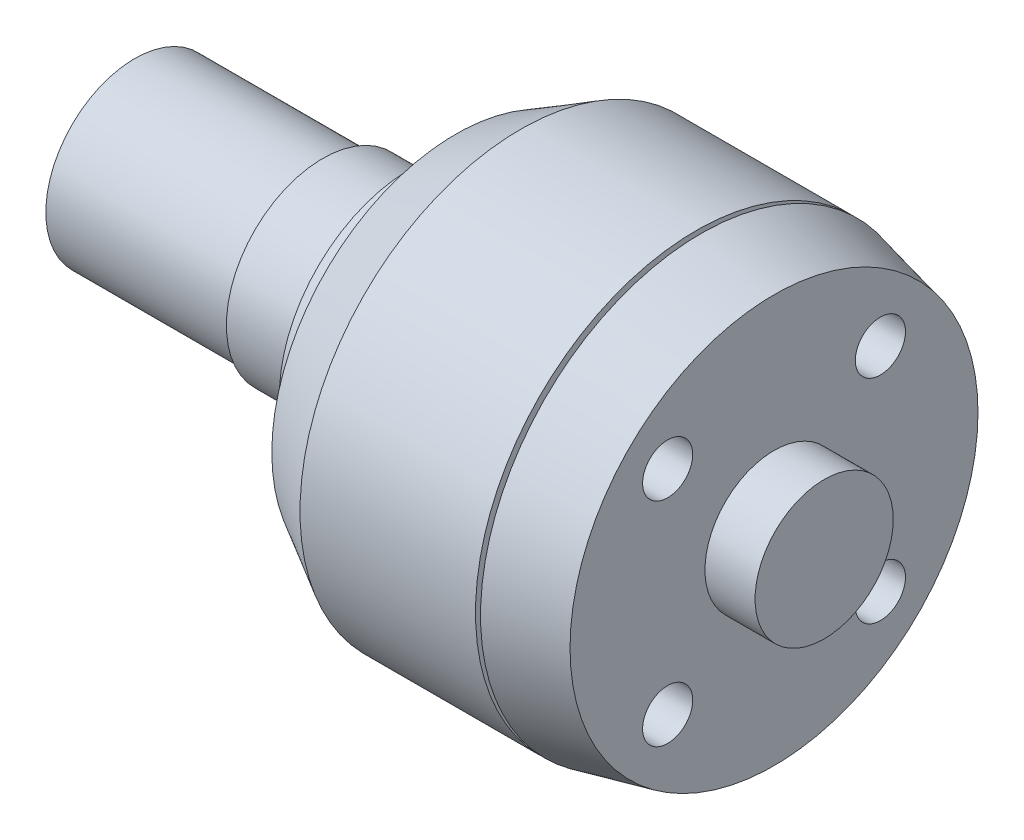
ISO-10303-21;
HEADER;
FILE_DESCRIPTION(('STEP AP214'),'2;1');
FILE_NAME('part.step','',(''),(''),'','','');
FILE_SCHEMA(('AUTOMOTIVE_DESIGN { 1 0 10303 214 1 1 1 1 }'));
ENDSEC;
DATA;
#1=APPLICATION_CONTEXT('core data for automotive mechanical design processes');
#2=APPLICATION_PROTOCOL_DEFINITION('international standard','automotive_design',2000,#1);
#3=PRODUCT_CONTEXT('',#1,'mechanical');
#4=PRODUCT('Part','Part','',(#3));
#5=PRODUCT_RELATED_PRODUCT_CATEGORY('part','',(#4));
#6=PRODUCT_DEFINITION_FORMATION('','',#4);
#7=PRODUCT_DEFINITION_CONTEXT('part definition',#1,'design');
#8=PRODUCT_DEFINITION('design','',#6,#7);
#9=PRODUCT_DEFINITION_SHAPE('','',#8);
#10=(LENGTH_UNIT() NAMED_UNIT(*) SI_UNIT(.MILLI.,.METRE.));
#11=(NAMED_UNIT(*) PLANE_ANGLE_UNIT() SI_UNIT($,.RADIAN.));
#12=(NAMED_UNIT(*) SI_UNIT($,.STERADIAN.) SOLID_ANGLE_UNIT());
#13=UNCERTAINTY_MEASURE_WITH_UNIT(LENGTH_MEASURE(1.E-05),#10,'distance_accuracy_value','');
#14=(GEOMETRIC_REPRESENTATION_CONTEXT(3) GLOBAL_UNCERTAINTY_ASSIGNED_CONTEXT((#13)) GLOBAL_UNIT_ASSIGNED_CONTEXT((#10,
#11,#12)) REPRESENTATION_CONTEXT('',''));
#15=CARTESIAN_POINT('',(0.,0.,0.));
#16=DIRECTION('',(0.,0.,1.));
#17=DIRECTION('',(1.,0.,0.));
#18=AXIS2_PLACEMENT_3D('',#15,#16,#17);
#19=CARTESIAN_POINT('',(16.2040634309573,0.,0.));
#20=DIRECTION('',(1.,0.,0.));
#21=DIRECTION('',(0.,0.,-1.));
#22=AXIS2_PLACEMENT_3D('',#19,#20,#21);
#23=CYLINDRICAL_SURFACE('',#22,3.54481033344011);
#24=CARTESIAN_POINT('',(-11.2959365690427,0.,0.));
#25=DIRECTION('',(1.,0.,0.));
#26=DIRECTION('',(0.,0.,-1.));
#27=AXIS2_PLACEMENT_3D('',#24,#25,#26);
#28=CIRCLE('',#27,3.54481033344011);
#29=CARTESIAN_POINT('',(-11.2959365690427,0.,-3.54481033344011));
#30=VERTEX_POINT('',#29);
#31=EDGE_CURVE('E12',#30,#30,#28,.T.);
#32=ORIENTED_EDGE('',*,*,#31,.T.);
#33=EDGE_LOOP('',(#32));
#34=FACE_BOUND('',#33,.T.);
#35=CARTESIAN_POINT('',(-3.79593656904273,0.,0.));
#36=DIRECTION('',(1.,0.,0.));
#37=DIRECTION('',(0.,0.,-1.));
#38=AXIS2_PLACEMENT_3D('',#35,#36,#37);
#39=CIRCLE('',#38,3.54481033344011);
#40=CARTESIAN_POINT('',(-3.79593656904273,0.,-3.54481033344011));
#41=VERTEX_POINT('',#40);
#42=EDGE_CURVE('E93',#41,#41,#39,.T.);
#43=ORIENTED_EDGE('',*,*,#42,.F.);
#44=EDGE_LOOP('',(#43));
#45=FACE_BOUND('',#44,.T.);
#46=ADVANCED_FACE('F44',(#34,#45),#23,.T.);
#47=CARTESIAN_POINT('',(-11.2959365690427,0.,0.));
#48=DIRECTION('',(-1.,0.,0.));
#49=DIRECTION('',(0.,0.,1.));
#50=AXIS2_PLACEMENT_3D('',#47,#48,#49);
#51=PLANE('',#50);
#52=ORIENTED_EDGE('',*,*,#31,.F.);
#53=EDGE_LOOP('',(#52));
#54=FACE_BOUND('',#53,.T.);
#55=ADVANCED_FACE('F150',(#54),#51,.T.);
#56=CARTESIAN_POINT('',(16.2040634309573,0.,-2.75506674369654));
#57=DIRECTION('',(1.,0.,0.));
#58=DIRECTION('',(0.,0.,-1.));
#59=AXIS2_PLACEMENT_3D('',#56,#57,#58);
#60=PLANE('',#59);
#61=CARTESIAN_POINT('',(16.2040634309573,0.,0.));
#62=DIRECTION('',(1.,0.,0.));
#63=DIRECTION('',(0.,0.,-1.));
#64=AXIS2_PLACEMENT_3D('',#61,#62,#63);
#65=CIRCLE('',#64,2.75506674369654);
#66=CARTESIAN_POINT('',(16.2040634309573,0.,-2.75506674369654));
#67=VERTEX_POINT('',#66);
#68=EDGE_CURVE('E50',#67,#67,#65,.T.);
#69=ORIENTED_EDGE('',*,*,#68,.T.);
#70=EDGE_LOOP('',(#69));
#71=FACE_BOUND('',#70,.T.);
#72=ADVANCED_FACE('F145',(#71),#60,.T.);
#73=CARTESIAN_POINT('',(16.2040634309573,0.,0.));
#74=DIRECTION('',(1.,0.,0.));
#75=DIRECTION('',(0.,0.,-1.));
#76=AXIS2_PLACEMENT_3D('',#73,#74,#75);
#77=CYLINDRICAL_SURFACE('',#76,2.75506674369654);
#78=CARTESIAN_POINT('',(14.2040634309573,0.,0.));
#79=DIRECTION('',(1.,0.,0.));
#80=DIRECTION('',(0.,0.,-1.));
#81=AXIS2_PLACEMENT_3D('',#78,#79,#80);
#82=CIRCLE('',#81,2.75506674369654);
#83=CARTESIAN_POINT('',(14.2040634309573,0.,-2.75506674369654));
#84=VERTEX_POINT('',#83);
#85=EDGE_CURVE('E54',#84,#84,#82,.T.);
#86=ORIENTED_EDGE('',*,*,#85,.T.);
#87=EDGE_LOOP('',(#86));
#88=FACE_BOUND('',#87,.T.);
#89=ORIENTED_EDGE('',*,*,#68,.F.);
#90=EDGE_LOOP('',(#89));
#91=FACE_BOUND('',#90,.T.);
#92=ADVANCED_FACE('F134',(#88,#91),#77,.T.);
#93=CARTESIAN_POINT('',(14.2040634309573,0.,-8.13630860878238));
#94=DIRECTION('',(1.,0.,0.));
#95=DIRECTION('',(0.,0.,-1.));
#96=AXIS2_PLACEMENT_3D('',#93,#94,#95);
#97=PLANE('',#96);
#98=CARTESIAN_POINT('',(14.2040634309573,4.24264068711929,-4.24264068711929));
#99=DIRECTION('',(1.,0.,0.));
#100=DIRECTION('',(0.,0.,-1.));
#101=AXIS2_PLACEMENT_3D('',#98,#99,#100);
#102=CIRCLE('',#101,1.);
#103=CARTESIAN_POINT('',(14.2040634309573,4.24264068711929,-5.24264068711929));
#104=VERTEX_POINT('',#103);
#105=EDGE_CURVE('E110',#104,#104,#102,.T.);
#106=ORIENTED_EDGE('',*,*,#105,.F.);
#107=EDGE_LOOP('',(#106));
#108=FACE_BOUND('',#107,.T.);
#109=CARTESIAN_POINT('',(14.2040634309573,-4.24264068711929,4.24264068711928));
#110=DIRECTION('',(1.,0.,0.));
#111=DIRECTION('',(0.,0.,-1.));
#112=AXIS2_PLACEMENT_3D('',#109,#110,#111);
#113=CIRCLE('',#112,1.);
#114=CARTESIAN_POINT('',(14.2040634309573,-4.24264068711929,3.24264068711928));
#115=VERTEX_POINT('',#114);
#116=EDGE_CURVE('E103',#115,#115,#113,.T.);
#117=ORIENTED_EDGE('',*,*,#116,.F.);
#118=EDGE_LOOP('',(#117));
#119=FACE_BOUND('',#118,.T.);
#120=CARTESIAN_POINT('',(14.2040634309573,4.24264068711929,4.24264068711928));
#121=DIRECTION('',(1.,0.,0.));
#122=DIRECTION('',(0.,0.,-1.));
#123=AXIS2_PLACEMENT_3D('',#120,#121,#122);
#124=CIRCLE('',#123,1.);
#125=CARTESIAN_POINT('',(14.2040634309573,4.24264068711929,3.24264068711928));
#126=VERTEX_POINT('',#125);
#127=EDGE_CURVE('E115',#126,#126,#124,.T.);
#128=ORIENTED_EDGE('',*,*,#127,.F.);
#129=EDGE_LOOP('',(#128));
#130=FACE_BOUND('',#129,.T.);
#131=CARTESIAN_POINT('',(14.2040634309573,-4.24264068711929,-4.24264068711929));
#132=DIRECTION('',(1.,0.,0.));
#133=DIRECTION('',(0.,0.,-1.));
#134=AXIS2_PLACEMENT_3D('',#131,#132,#133);
#135=CIRCLE('',#134,1.);
#136=CARTESIAN_POINT('',(14.2040634309573,-4.24264068711929,-5.24264068711929));
#137=VERTEX_POINT('',#136);
#138=EDGE_CURVE('E97',#137,#137,#135,.T.);
#139=ORIENTED_EDGE('',*,*,#138,.F.);
#140=EDGE_LOOP('',(#139));
#141=FACE_BOUND('',#140,.T.);
#142=CARTESIAN_POINT('',(14.2040634309573,0.,0.));
#143=DIRECTION('',(1.,0.,0.));
#144=DIRECTION('',(0.,0.,-1.));
#145=AXIS2_PLACEMENT_3D('',#142,#143,#144);
#146=CIRCLE('',#145,8.13630860878238);
#147=CARTESIAN_POINT('',(14.2040634309573,0.,-8.13630860878238));
#148=VERTEX_POINT('',#147);
#149=EDGE_CURVE('E58',#148,#148,#146,.T.);
#150=ORIENTED_EDGE('',*,*,#149,.T.);
#151=EDGE_LOOP('',(#150));
#152=FACE_BOUND('',#151,.T.);
#153=ORIENTED_EDGE('',*,*,#85,.F.);
#154=EDGE_LOOP('',(#153));
#155=FACE_BOUND('',#154,.T.);
#156=ADVANCED_FACE('F130',(#108,#119,#130,#141,#152,#155),#97,.T.);
#157=CARTESIAN_POINT('',(14.2040634309573,0.,0.));
#158=DIRECTION('',(-1.,0.,0.));
#159=DIRECTION('',(0.,0.,1.));
#160=AXIS2_PLACEMENT_3D('',#157,#158,#159);
#161=CONICAL_SURFACE('',#160,8.13630860878238,0.224529527170123);
#162=CARTESIAN_POINT('',(11.2979836358391,0.,0.));
#163=DIRECTION('',(1.,0.,0.));
#164=DIRECTION('',(0.,0.,-1.));
#165=AXIS2_PLACEMENT_3D('',#162,#163,#164);
#166=CIRCLE('',#165,8.8);
#167=CARTESIAN_POINT('',(11.2979836358391,0.,-8.8));
#168=VERTEX_POINT('',#167);
#169=EDGE_CURVE('E63',#168,#168,#166,.T.);
#170=ORIENTED_EDGE('',*,*,#169,.T.);
#171=EDGE_LOOP('',(#170));
#172=FACE_BOUND('',#171,.T.);
#173=ORIENTED_EDGE('',*,*,#149,.F.);
#174=EDGE_LOOP('',(#173));
#175=FACE_BOUND('',#174,.T.);
#176=ADVANCED_FACE('F133',(#172,#175),#161,.T.);
#177=CARTESIAN_POINT('',(11.2979836358391,0.,-7.08537533518294));
#178=DIRECTION('',(-1.,0.,0.));
#179=DIRECTION('',(0.,0.,1.));
#180=AXIS2_PLACEMENT_3D('',#177,#178,#179);
#181=PLANE('',#180);
#182=CARTESIAN_POINT('',(11.2979836358391,0.,0.));
#183=DIRECTION('',(1.,0.,0.));
#184=DIRECTION('',(0.,0.,-1.));
#185=AXIS2_PLACEMENT_3D('',#182,#183,#184);
#186=CIRCLE('',#185,7.08537533518294);
#187=CARTESIAN_POINT('',(11.2979836358391,0.,-7.08537533518294));
#188=VERTEX_POINT('',#187);
#189=EDGE_CURVE('E66',#188,#188,#186,.T.);
#190=ORIENTED_EDGE('',*,*,#189,.T.);
#191=EDGE_LOOP('',(#190));
#192=FACE_BOUND('',#191,.T.);
#193=ORIENTED_EDGE('',*,*,#169,.F.);
#194=EDGE_LOOP('',(#193));
#195=FACE_BOUND('',#194,.T.);
#196=ADVANCED_FACE('F212',(#192,#195),#181,.T.);
#197=CARTESIAN_POINT('',(16.2040634309573,0.,0.));
#198=DIRECTION('',(1.,0.,0.));
#199=DIRECTION('',(0.,0.,-1.));
#200=AXIS2_PLACEMENT_3D('',#197,#198,#199);
#201=CYLINDRICAL_SURFACE('',#200,7.08537533518294);
#202=CARTESIAN_POINT('',(11.0979836358391,0.,0.));
#203=DIRECTION('',(1.,0.,0.));
#204=DIRECTION('',(0.,0.,-1.));
#205=AXIS2_PLACEMENT_3D('',#202,#203,#204);
#206=CIRCLE('',#205,7.08537533518294);
#207=CARTESIAN_POINT('',(11.0979836358391,0.,-7.08537533518294));
#208=VERTEX_POINT('',#207);
#209=EDGE_CURVE('E69',#208,#208,#206,.T.);
#210=ORIENTED_EDGE('',*,*,#209,.T.);
#211=EDGE_LOOP('',(#210));
#212=FACE_BOUND('',#211,.T.);
#213=ORIENTED_EDGE('',*,*,#189,.F.);
#214=EDGE_LOOP('',(#213));
#215=FACE_BOUND('',#214,.T.);
#216=ADVANCED_FACE('F206',(#212,#215),#201,.T.);
#217=CARTESIAN_POINT('',(11.0979836358391,0.,-8.8));
#218=DIRECTION('',(1.,0.,0.));
#219=DIRECTION('',(0.,0.,-1.));
#220=AXIS2_PLACEMENT_3D('',#217,#218,#219);
#221=PLANE('',#220);
#222=CARTESIAN_POINT('',(11.0979836358391,0.,0.));
#223=DIRECTION('',(1.,0.,0.));
#224=DIRECTION('',(0.,0.,-1.));
#225=AXIS2_PLACEMENT_3D('',#222,#223,#224);
#226=CIRCLE('',#225,8.8);
#227=CARTESIAN_POINT('',(11.0979836358391,0.,-8.8));
#228=VERTEX_POINT('',#227);
#229=EDGE_CURVE('E72',#228,#228,#226,.T.);
#230=ORIENTED_EDGE('',*,*,#229,.T.);
#231=EDGE_LOOP('',(#230));
#232=FACE_BOUND('',#231,.T.);
#233=ORIENTED_EDGE('',*,*,#209,.F.);
#234=EDGE_LOOP('',(#233));
#235=FACE_BOUND('',#234,.T.);
#236=ADVANCED_FACE('F200',(#232,#235),#221,.T.);
#237=CARTESIAN_POINT('',(16.2040634309573,0.,0.));
#238=DIRECTION('',(1.,0.,0.));
#239=DIRECTION('',(0.,0.,-1.));
#240=AXIS2_PLACEMENT_3D('',#237,#238,#239);
#241=CYLINDRICAL_SURFACE('',#240,8.8);
#242=CARTESIAN_POINT('',(4.09798363583906,0.,0.));
#243=DIRECTION('',(1.,0.,0.));
#244=DIRECTION('',(0.,0.,-1.));
#245=AXIS2_PLACEMENT_3D('',#242,#243,#244);
#246=CIRCLE('',#245,8.8);
#247=CARTESIAN_POINT('',(4.09798363583906,0.,-8.8));
#248=VERTEX_POINT('',#247);
#249=EDGE_CURVE('E75',#248,#248,#246,.T.);
#250=ORIENTED_EDGE('',*,*,#249,.T.);
#251=EDGE_LOOP('',(#250));
#252=FACE_BOUND('',#251,.T.);
#253=ORIENTED_EDGE('',*,*,#229,.F.);
#254=EDGE_LOOP('',(#253));
#255=FACE_BOUND('',#254,.T.);
#256=ADVANCED_FACE('F194',(#252,#255),#241,.T.);
#257=CARTESIAN_POINT('',(4.09798363583906,0.,0.));
#258=DIRECTION('',(1.,0.,0.));
#259=DIRECTION('',(0.,0.,-1.));
#260=AXIS2_PLACEMENT_3D('',#257,#258,#259);
#261=CONICAL_SURFACE('',#260,8.8,0.515230487157352);
#262=CARTESIAN_POINT('',(1.50406343095727,0.,0.));
#263=DIRECTION('',(1.,0.,0.));
#264=DIRECTION('',(0.,0.,-1.));
#265=AXIS2_PLACEMENT_3D('',#262,#263,#264);
#266=CIRCLE('',#265,7.33120321042127);
#267=CARTESIAN_POINT('',(1.50406343095727,0.,-7.33120321042127));
#268=VERTEX_POINT('',#267);
#269=EDGE_CURVE('E78',#268,#268,#266,.T.);
#270=ORIENTED_EDGE('',*,*,#269,.T.);
#271=EDGE_LOOP('',(#270));
#272=FACE_BOUND('',#271,.T.);
#273=ORIENTED_EDGE('',*,*,#249,.F.);
#274=EDGE_LOOP('',(#273));
#275=FACE_BOUND('',#274,.T.);
#276=ADVANCED_FACE('F188',(#272,#275),#261,.T.);
#277=CARTESIAN_POINT('',(1.50406343095727,0.,-5.23139923501229));
#278=DIRECTION('',(-1.,0.,0.));
#279=DIRECTION('',(0.,0.,1.));
#280=AXIS2_PLACEMENT_3D('',#277,#278,#279);
#281=PLANE('',#280);
#282=CARTESIAN_POINT('',(1.50406343095727,0.,0.));
#283=DIRECTION('',(1.,0.,0.));
#284=DIRECTION('',(0.,0.,-1.));
#285=AXIS2_PLACEMENT_3D('',#282,#283,#284);
#286=CIRCLE('',#285,5.23139923501229);
#287=CARTESIAN_POINT('',(1.50406343095727,0.,-5.23139923501229));
#288=VERTEX_POINT('',#287);
#289=EDGE_CURVE('E81',#288,#288,#286,.T.);
#290=ORIENTED_EDGE('',*,*,#289,.T.);
#291=EDGE_LOOP('',(#290));
#292=FACE_BOUND('',#291,.T.);
#293=ORIENTED_EDGE('',*,*,#269,.F.);
#294=EDGE_LOOP('',(#293));
#295=FACE_BOUND('',#294,.T.);
#296=ADVANCED_FACE('F182',(#292,#295),#281,.T.);
#297=CARTESIAN_POINT('',(16.2040634309573,0.,0.));
#298=DIRECTION('',(1.,0.,0.));
#299=DIRECTION('',(0.,0.,-1.));
#300=AXIS2_PLACEMENT_3D('',#297,#298,#299);
#301=CYLINDRICAL_SURFACE('',#300,5.23139923501229);
#302=CARTESIAN_POINT('',(-0.295936569042726,0.,0.));
#303=DIRECTION('',(1.,0.,0.));
#304=DIRECTION('',(0.,0.,-1.));
#305=AXIS2_PLACEMENT_3D('',#302,#303,#304);
#306=CIRCLE('',#305,5.23139923501229);
#307=CARTESIAN_POINT('',(-0.295936569042727,0.,-5.23139923501229));
#308=VERTEX_POINT('',#307);
#309=EDGE_CURVE('E84',#308,#308,#306,.T.);
#310=ORIENTED_EDGE('',*,*,#309,.T.);
#311=EDGE_LOOP('',(#310));
#312=FACE_BOUND('',#311,.T.);
#313=ORIENTED_EDGE('',*,*,#289,.F.);
#314=EDGE_LOOP('',(#313));
#315=FACE_BOUND('',#314,.T.);
#316=ADVANCED_FACE('F176',(#312,#315),#301,.T.);
#317=CARTESIAN_POINT('',(-0.295936569042726,0.,-3.84395381815795));
#318=DIRECTION('',(-1.,0.,0.));
#319=DIRECTION('',(0.,0.,1.));
#320=AXIS2_PLACEMENT_3D('',#317,#318,#319);
#321=PLANE('',#320);
#322=CARTESIAN_POINT('',(-0.295936569042726,0.,0.));
#323=DIRECTION('',(1.,0.,0.));
#324=DIRECTION('',(0.,0.,-1.));
#325=AXIS2_PLACEMENT_3D('',#322,#323,#324);
#326=CIRCLE('',#325,3.84395381815795);
#327=CARTESIAN_POINT('',(-0.295936569042727,0.,-3.84395381815795));
#328=VERTEX_POINT('',#327);
#329=EDGE_CURVE('E87',#328,#328,#326,.T.);
#330=ORIENTED_EDGE('',*,*,#329,.T.);
#331=EDGE_LOOP('',(#330));
#332=FACE_BOUND('',#331,.T.);
#333=ORIENTED_EDGE('',*,*,#309,.F.);
#334=EDGE_LOOP('',(#333));
#335=FACE_BOUND('',#334,.T.);
#336=ADVANCED_FACE('F170',(#332,#335),#321,.T.);
#337=CARTESIAN_POINT('',(16.2040634309573,0.,0.));
#338=DIRECTION('',(1.,0.,0.));
#339=DIRECTION('',(0.,0.,-1.));
#340=AXIS2_PLACEMENT_3D('',#337,#338,#339);
#341=CYLINDRICAL_SURFACE('',#340,3.84395381815795);
#342=CARTESIAN_POINT('',(-3.79593656904273,0.,0.));
#343=DIRECTION('',(1.,0.,0.));
#344=DIRECTION('',(0.,0.,-1.));
#345=AXIS2_PLACEMENT_3D('',#342,#343,#344);
#346=CIRCLE('',#345,3.84395381815795);
#347=CARTESIAN_POINT('',(-3.79593656904273,0.,-3.84395381815795));
#348=VERTEX_POINT('',#347);
#349=EDGE_CURVE('E90',#348,#348,#346,.T.);
#350=ORIENTED_EDGE('',*,*,#349,.T.);
#351=EDGE_LOOP('',(#350));
#352=FACE_BOUND('',#351,.T.);
#353=ORIENTED_EDGE('',*,*,#329,.F.);
#354=EDGE_LOOP('',(#353));
#355=FACE_BOUND('',#354,.T.);
#356=ADVANCED_FACE('F164',(#352,#355),#341,.T.);
#357=CARTESIAN_POINT('',(-3.79593656904273,0.,-3.54481033344011));
#358=DIRECTION('',(-1.,0.,0.));
#359=DIRECTION('',(0.,0.,1.));
#360=AXIS2_PLACEMENT_3D('',#357,#358,#359);
#361=PLANE('',#360);
#362=ORIENTED_EDGE('',*,*,#42,.T.);
#363=EDGE_LOOP('',(#362));
#364=FACE_BOUND('',#363,.T.);
#365=ORIENTED_EDGE('',*,*,#349,.F.);
#366=EDGE_LOOP('',(#365));
#367=FACE_BOUND('',#366,.T.);
#368=ADVANCED_FACE('F160',(#364,#367),#361,.T.);
#369=CARTESIAN_POINT('',(12.2040634309573,-4.24264068711929,-4.24264068711929));
#370=DIRECTION('',(1.,0.,0.));
#371=DIRECTION('',(0.,0.,-1.));
#372=AXIS2_PLACEMENT_3D('',#369,#370,#371);
#373=CYLINDRICAL_SURFACE('',#372,1.);
#374=CARTESIAN_POINT('',(12.2040634309573,-4.24264068711929,-4.24264068711929));
#375=DIRECTION('',(1.,0.,0.));
#376=DIRECTION('',(0.,0.,-1.));
#377=AXIS2_PLACEMENT_3D('',#374,#375,#376);
#378=CIRCLE('',#377,1.);
#379=CARTESIAN_POINT('',(12.2040634309573,-4.24264068711929,-5.24264068711929));
#380=VERTEX_POINT('',#379);
#381=EDGE_CURVE('E96',#380,#380,#378,.T.);
#382=ORIENTED_EDGE('',*,*,#381,.F.);
#383=EDGE_LOOP('',(#382));
#384=FACE_BOUND('',#383,.T.);
#385=ORIENTED_EDGE('',*,*,#138,.T.);
#386=EDGE_LOOP('',(#385));
#387=FACE_BOUND('',#386,.T.);
#388=ADVANCED_FACE('F163',(#384,#387),#373,.F.);
#389=CARTESIAN_POINT('',(12.2040634309573,-4.24264068711929,-4.24264068711929));
#390=DIRECTION('',(1.,0.,0.));
#391=DIRECTION('',(0.,0.,-1.));
#392=AXIS2_PLACEMENT_3D('',#389,#390,#391);
#393=PLANE('',#392);
#394=ORIENTED_EDGE('',*,*,#381,.T.);
#395=EDGE_LOOP('',(#394));
#396=FACE_BOUND('',#395,.T.);
#397=ADVANCED_FACE('F126',(#396),#393,.T.);
#398=CARTESIAN_POINT('',(12.2040634309573,4.24264068711929,4.24264068711928));
#399=DIRECTION('',(1.,0.,0.));
#400=DIRECTION('',(0.,0.,-1.));
#401=AXIS2_PLACEMENT_3D('',#398,#399,#400);
#402=CYLINDRICAL_SURFACE('',#401,1.);
#403=CARTESIAN_POINT('',(12.2040634309573,4.24264068711929,4.24264068711928));
#404=DIRECTION('',(1.,0.,0.));
#405=DIRECTION('',(0.,0.,-1.));
#406=AXIS2_PLACEMENT_3D('',#403,#404,#405);
#407=CIRCLE('',#406,1.);
#408=CARTESIAN_POINT('',(12.2040634309573,4.24264068711929,3.24264068711928));
#409=VERTEX_POINT('',#408);
#410=EDGE_CURVE('E107',#409,#409,#407,.T.);
#411=ORIENTED_EDGE('',*,*,#410,.F.);
#412=EDGE_LOOP('',(#411));
#413=FACE_BOUND('',#412,.T.);
#414=ORIENTED_EDGE('',*,*,#127,.T.);
#415=EDGE_LOOP('',(#414));
#416=FACE_BOUND('',#415,.T.);
#417=ADVANCED_FACE('F123',(#413,#416),#402,.F.);
#418=CARTESIAN_POINT('',(12.2040634309573,4.24264068711929,4.24264068711928));
#419=DIRECTION('',(1.,0.,0.));
#420=DIRECTION('',(0.,0.,-1.));
#421=AXIS2_PLACEMENT_3D('',#418,#419,#420);
#422=PLANE('',#421);
#423=ORIENTED_EDGE('',*,*,#410,.T.);
#424=EDGE_LOOP('',(#423));
#425=FACE_BOUND('',#424,.T.);
#426=ADVANCED_FACE('F121',(#425),#422,.T.);
#427=CARTESIAN_POINT('',(12.2040634309573,-4.24264068711929,4.24264068711928));
#428=DIRECTION('',(1.,0.,0.));
#429=DIRECTION('',(0.,0.,-1.));
#430=AXIS2_PLACEMENT_3D('',#427,#428,#429);
#431=CYLINDRICAL_SURFACE('',#430,1.);
#432=CARTESIAN_POINT('',(12.2040634309573,-4.24264068711929,4.24264068711928));
#433=DIRECTION('',(1.,0.,0.));
#434=DIRECTION('',(0.,0.,-1.));
#435=AXIS2_PLACEMENT_3D('',#432,#433,#434);
#436=CIRCLE('',#435,1.);
#437=CARTESIAN_POINT('',(12.2040634309573,-4.24264068711929,3.24264068711928));
#438=VERTEX_POINT('',#437);
#439=EDGE_CURVE('E106',#438,#438,#436,.T.);
#440=ORIENTED_EDGE('',*,*,#439,.F.);
#441=EDGE_LOOP('',(#440));
#442=FACE_BOUND('',#441,.T.);
#443=ORIENTED_EDGE('',*,*,#116,.T.);
#444=EDGE_LOOP('',(#443));
#445=FACE_BOUND('',#444,.T.);
#446=ADVANCED_FACE('F233',(#442,#445),#431,.F.);
#447=CARTESIAN_POINT('',(12.2040634309573,-4.24264068711929,4.24264068711928));
#448=DIRECTION('',(1.,0.,0.));
#449=DIRECTION('',(0.,0.,-1.));
#450=AXIS2_PLACEMENT_3D('',#447,#448,#449);
#451=PLANE('',#450);
#452=ORIENTED_EDGE('',*,*,#439,.T.);
#453=EDGE_LOOP('',(#452));
#454=FACE_BOUND('',#453,.T.);
#455=ADVANCED_FACE('F236',(#454),#451,.T.);
#456=CARTESIAN_POINT('',(12.2040634309573,4.24264068711929,-4.24264068711929));
#457=DIRECTION('',(1.,0.,0.));
#458=DIRECTION('',(0.,0.,-1.));
#459=AXIS2_PLACEMENT_3D('',#456,#457,#458);
#460=CYLINDRICAL_SURFACE('',#459,1.);
#461=CARTESIAN_POINT('',(12.2040634309573,4.24264068711929,-4.24264068711929));
#462=DIRECTION('',(1.,0.,0.));
#463=DIRECTION('',(0.,0.,-1.));
#464=AXIS2_PLACEMENT_3D('',#461,#462,#463);
#465=CIRCLE('',#464,1.);
#466=CARTESIAN_POINT('',(12.2040634309573,4.24264068711929,-5.24264068711929));
#467=VERTEX_POINT('',#466);
#468=EDGE_CURVE('E100',#467,#467,#465,.T.);
#469=ORIENTED_EDGE('',*,*,#468,.F.);
#470=EDGE_LOOP('',(#469));
#471=FACE_BOUND('',#470,.T.);
#472=ORIENTED_EDGE('',*,*,#105,.T.);
#473=EDGE_LOOP('',(#472));
#474=FACE_BOUND('',#473,.T.);
#475=ADVANCED_FACE('F240',(#471,#474),#460,.F.);
#476=CARTESIAN_POINT('',(12.2040634309573,4.24264068711929,-4.24264068711929));
#477=DIRECTION('',(1.,0.,0.));
#478=DIRECTION('',(0.,0.,-1.));
#479=AXIS2_PLACEMENT_3D('',#476,#477,#478);
#480=PLANE('',#479);
#481=ORIENTED_EDGE('',*,*,#468,.T.);
#482=EDGE_LOOP('',(#481));
#483=FACE_BOUND('',#482,.T.);
#484=ADVANCED_FACE('F244',(#483),#480,.T.);
#485=CLOSED_SHELL('',(#46,#55,#72,#92,#156,#176,#196,#216,#236,#256,#276,#296,#316,#336,#356,
#368,#388,#397,#417,#426,#446,#455,#475,#484));
#486=MANIFOLD_SOLID_BREP('B2',#485);
#487=ADVANCED_BREP_SHAPE_REPRESENTATION('',(#18,#486),#14);
#488=SHAPE_DEFINITION_REPRESENTATION(#9,#487);
ENDSEC;
END-ISO-10303-21;
